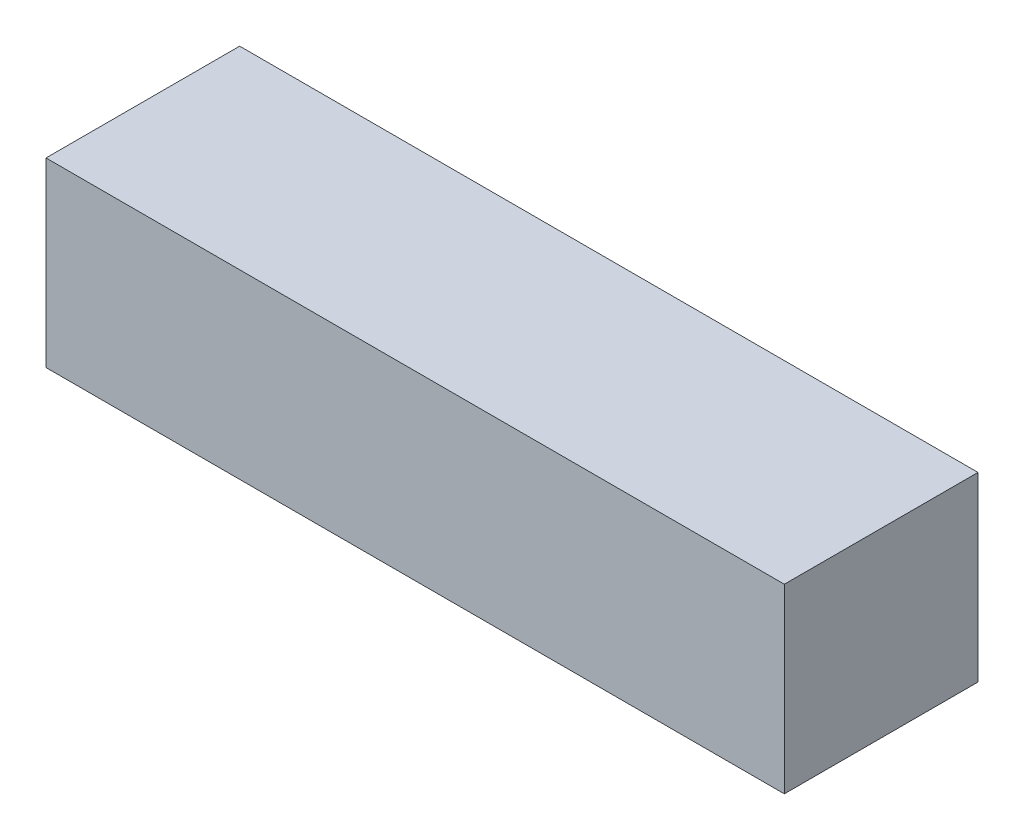
ISO-10303-21;
HEADER;
FILE_DESCRIPTION(('STEP AP214'),'2;1');
FILE_NAME('part.step','',(''),(''),'','','');
FILE_SCHEMA(('AUTOMOTIVE_DESIGN { 1 0 10303 214 1 1 1 1 }'));
ENDSEC;
DATA;
#1=APPLICATION_CONTEXT('core data for automotive mechanical design processes');
#2=APPLICATION_PROTOCOL_DEFINITION('international standard','automotive_design',2000,#1);
#3=PRODUCT_CONTEXT('',#1,'mechanical');
#4=PRODUCT('Part','Part','',(#3));
#5=PRODUCT_RELATED_PRODUCT_CATEGORY('part','',(#4));
#6=PRODUCT_DEFINITION_FORMATION('','',#4);
#7=PRODUCT_DEFINITION_CONTEXT('part definition',#1,'design');
#8=PRODUCT_DEFINITION('design','',#6,#7);
#9=PRODUCT_DEFINITION_SHAPE('','',#8);
#10=(LENGTH_UNIT() NAMED_UNIT(*) SI_UNIT(.MILLI.,.METRE.));
#11=(NAMED_UNIT(*) PLANE_ANGLE_UNIT() SI_UNIT($,.RADIAN.));
#12=(NAMED_UNIT(*) SI_UNIT($,.STERADIAN.) SOLID_ANGLE_UNIT());
#13=UNCERTAINTY_MEASURE_WITH_UNIT(LENGTH_MEASURE(1.E-05),#10,'distance_accuracy_value','');
#14=(GEOMETRIC_REPRESENTATION_CONTEXT(3) GLOBAL_UNCERTAINTY_ASSIGNED_CONTEXT((#13)) GLOBAL_UNIT_ASSIGNED_CONTEXT((#10,
#11,#12)) REPRESENTATION_CONTEXT('',''));
#15=CARTESIAN_POINT('',(0.,0.,0.));
#16=DIRECTION('',(0.,0.,1.));
#17=DIRECTION('',(1.,0.,0.));
#18=AXIS2_PLACEMENT_3D('',#15,#16,#17);
#19=CARTESIAN_POINT('',(30.5,7.5,8.));
#20=DIRECTION('',(-1.,0.,0.));
#21=DIRECTION('',(0.,0.,1.));
#22=AXIS2_PLACEMENT_3D('',#19,#20,#21);
#23=PLANE('',#22);
#24=DIRECTION('',(0.,0.,-1.));
#25=VECTOR('',#24,1.);
#26=CARTESIAN_POINT('',(30.5,-7.5,8.));
#27=LINE('',#26,#25);
#28=CARTESIAN_POINT('',(30.5,-7.5,8.));
#29=VERTEX_POINT('',#28);
#30=CARTESIAN_POINT('',(30.5,-7.5,-8.));
#31=VERTEX_POINT('',#30);
#32=EDGE_CURVE('E105',#29,#31,#27,.T.);
#33=ORIENTED_EDGE('',*,*,#32,.T.);
#34=DIRECTION('',(0.,-1.,0.));
#35=VECTOR('',#34,1.);
#36=CARTESIAN_POINT('',(30.5,7.5,-8.));
#37=LINE('',#36,#35);
#38=CARTESIAN_POINT('',(30.5,7.5,-8.));
#39=VERTEX_POINT('',#38);
#40=EDGE_CURVE('E11',#39,#31,#37,.T.);
#41=ORIENTED_EDGE('',*,*,#40,.F.);
#42=DIRECTION('',(0.,0.,-1.));
#43=VECTOR('',#42,1.);
#44=CARTESIAN_POINT('',(30.5,7.5,8.));
#45=LINE('',#44,#43);
#46=CARTESIAN_POINT('',(30.5,7.5,8.));
#47=VERTEX_POINT('',#46);
#48=EDGE_CURVE('E89',#47,#39,#45,.T.);
#49=ORIENTED_EDGE('',*,*,#48,.F.);
#50=DIRECTION('',(0.,-1.,0.));
#51=VECTOR('',#50,1.);
#52=CARTESIAN_POINT('',(30.5,7.5,8.));
#53=LINE('',#52,#51);
#54=EDGE_CURVE('E97',#47,#29,#53,.T.);
#55=ORIENTED_EDGE('',*,*,#54,.T.);
#56=EDGE_LOOP('',(#33,#41,#49,#55));
#57=FACE_BOUND('',#56,.T.);
#58=ADVANCED_FACE('F39',(#57),#23,.F.);
#59=CARTESIAN_POINT('',(-30.5,7.5,-8.));
#60=DIRECTION('',(0.,0.,1.));
#61=DIRECTION('',(1.,0.,0.));
#62=AXIS2_PLACEMENT_3D('',#59,#60,#61);
#63=PLANE('',#62);
#64=DIRECTION('',(-1.,0.,0.));
#65=VECTOR('',#64,1.);
#66=CARTESIAN_POINT('',(-30.5,-7.5,-8.));
#67=LINE('',#66,#65);
#68=CARTESIAN_POINT('',(-30.5,-7.5,-8.));
#69=VERTEX_POINT('',#68);
#70=EDGE_CURVE('E92',#31,#69,#67,.T.);
#71=ORIENTED_EDGE('',*,*,#70,.T.);
#72=DIRECTION('',(0.,-1.,0.));
#73=VECTOR('',#72,1.);
#74=CARTESIAN_POINT('',(-30.5,7.5,-8.));
#75=LINE('',#74,#73);
#76=CARTESIAN_POINT('',(-30.5,7.5,-8.));
#77=VERTEX_POINT('',#76);
#78=EDGE_CURVE('E50',#77,#69,#75,.T.);
#79=ORIENTED_EDGE('',*,*,#78,.F.);
#80=DIRECTION('',(-1.,0.,0.));
#81=VECTOR('',#80,1.);
#82=CARTESIAN_POINT('',(-30.5,7.5,-8.));
#83=LINE('',#82,#81);
#84=EDGE_CURVE('E82',#39,#77,#83,.T.);
#85=ORIENTED_EDGE('',*,*,#84,.F.);
#86=ORIENTED_EDGE('',*,*,#40,.T.);
#87=EDGE_LOOP('',(#71,#79,#85,#86));
#88=FACE_BOUND('',#87,.T.);
#89=ADVANCED_FACE('F93',(#88),#63,.F.);
#90=CARTESIAN_POINT('',(-30.5,7.5,8.));
#91=DIRECTION('',(1.,0.,0.));
#92=DIRECTION('',(0.,0.,-1.));
#93=AXIS2_PLACEMENT_3D('',#90,#91,#92);
#94=PLANE('',#93);
#95=DIRECTION('',(0.,0.,1.));
#96=VECTOR('',#95,1.);
#97=CARTESIAN_POINT('',(-30.5,-7.5,8.));
#98=LINE('',#97,#96);
#99=CARTESIAN_POINT('',(-30.5,-7.5,8.));
#100=VERTEX_POINT('',#99);
#101=EDGE_CURVE('E72',#69,#100,#98,.T.);
#102=ORIENTED_EDGE('',*,*,#101,.T.);
#103=DIRECTION('',(0.,-1.,0.));
#104=VECTOR('',#103,1.);
#105=CARTESIAN_POINT('',(-30.5,7.5,8.));
#106=LINE('',#105,#104);
#107=CARTESIAN_POINT('',(-30.5,7.5,8.));
#108=VERTEX_POINT('',#107);
#109=EDGE_CURVE('E94',#108,#100,#106,.T.);
#110=ORIENTED_EDGE('',*,*,#109,.F.);
#111=DIRECTION('',(0.,0.,1.));
#112=VECTOR('',#111,1.);
#113=CARTESIAN_POINT('',(-30.5,7.5,8.));
#114=LINE('',#113,#112);
#115=EDGE_CURVE('E88',#77,#108,#114,.T.);
#116=ORIENTED_EDGE('',*,*,#115,.F.);
#117=ORIENTED_EDGE('',*,*,#78,.T.);
#118=EDGE_LOOP('',(#102,#110,#116,#117));
#119=FACE_BOUND('',#118,.T.);
#120=ADVANCED_FACE('F96',(#119),#94,.F.);
#121=CARTESIAN_POINT('',(-30.5,7.5,8.));
#122=DIRECTION('',(0.,0.,-1.));
#123=DIRECTION('',(-1.,0.,0.));
#124=AXIS2_PLACEMENT_3D('',#121,#122,#123);
#125=PLANE('',#124);
#126=DIRECTION('',(1.,0.,0.));
#127=VECTOR('',#126,1.);
#128=CARTESIAN_POINT('',(-30.5,-7.5,8.));
#129=LINE('',#128,#127);
#130=EDGE_CURVE('E76',#100,#29,#129,.T.);
#131=ORIENTED_EDGE('',*,*,#130,.T.);
#132=ORIENTED_EDGE('',*,*,#54,.F.);
#133=DIRECTION('',(1.,0.,0.));
#134=VECTOR('',#133,1.);
#135=CARTESIAN_POINT('',(-30.5,7.5,8.));
#136=LINE('',#135,#134);
#137=EDGE_CURVE('E54',#108,#47,#136,.T.);
#138=ORIENTED_EDGE('',*,*,#137,.F.);
#139=ORIENTED_EDGE('',*,*,#109,.T.);
#140=EDGE_LOOP('',(#131,#132,#138,#139));
#141=FACE_BOUND('',#140,.T.);
#142=ADVANCED_FACE('F108',(#141),#125,.F.);
#143=CARTESIAN_POINT('',(0.,7.5,0.));
#144=DIRECTION('',(0.,-1.,0.));
#145=DIRECTION('',(0.,0.,-1.));
#146=AXIS2_PLACEMENT_3D('',#143,#144,#145);
#147=PLANE('',#146);
#148=ORIENTED_EDGE('',*,*,#48,.T.);
#149=ORIENTED_EDGE('',*,*,#84,.T.);
#150=ORIENTED_EDGE('',*,*,#115,.T.);
#151=ORIENTED_EDGE('',*,*,#137,.T.);
#152=EDGE_LOOP('',(#148,#149,#150,#151));
#153=FACE_BOUND('',#152,.T.);
#154=ADVANCED_FACE('F86',(#153),#147,.F.);
#155=CARTESIAN_POINT('',(0.,-7.5,0.));
#156=DIRECTION('',(0.,-1.,0.));
#157=DIRECTION('',(0.,0.,-1.));
#158=AXIS2_PLACEMENT_3D('',#155,#156,#157);
#159=PLANE('',#158);
#160=ORIENTED_EDGE('',*,*,#32,.F.);
#161=ORIENTED_EDGE('',*,*,#130,.F.);
#162=ORIENTED_EDGE('',*,*,#101,.F.);
#163=ORIENTED_EDGE('',*,*,#70,.F.);
#164=EDGE_LOOP('',(#160,#161,#162,#163));
#165=FACE_BOUND('',#164,.T.);
#166=ADVANCED_FACE('F115',(#165),#159,.T.);
#167=CLOSED_SHELL('',(#58,#89,#120,#142,#154,#166));
#168=MANIFOLD_SOLID_BREP('B2',#167);
#169=ADVANCED_BREP_SHAPE_REPRESENTATION('',(#18,#168),#14);
#170=SHAPE_DEFINITION_REPRESENTATION(#9,#169);
ENDSEC;
END-ISO-10303-21;
